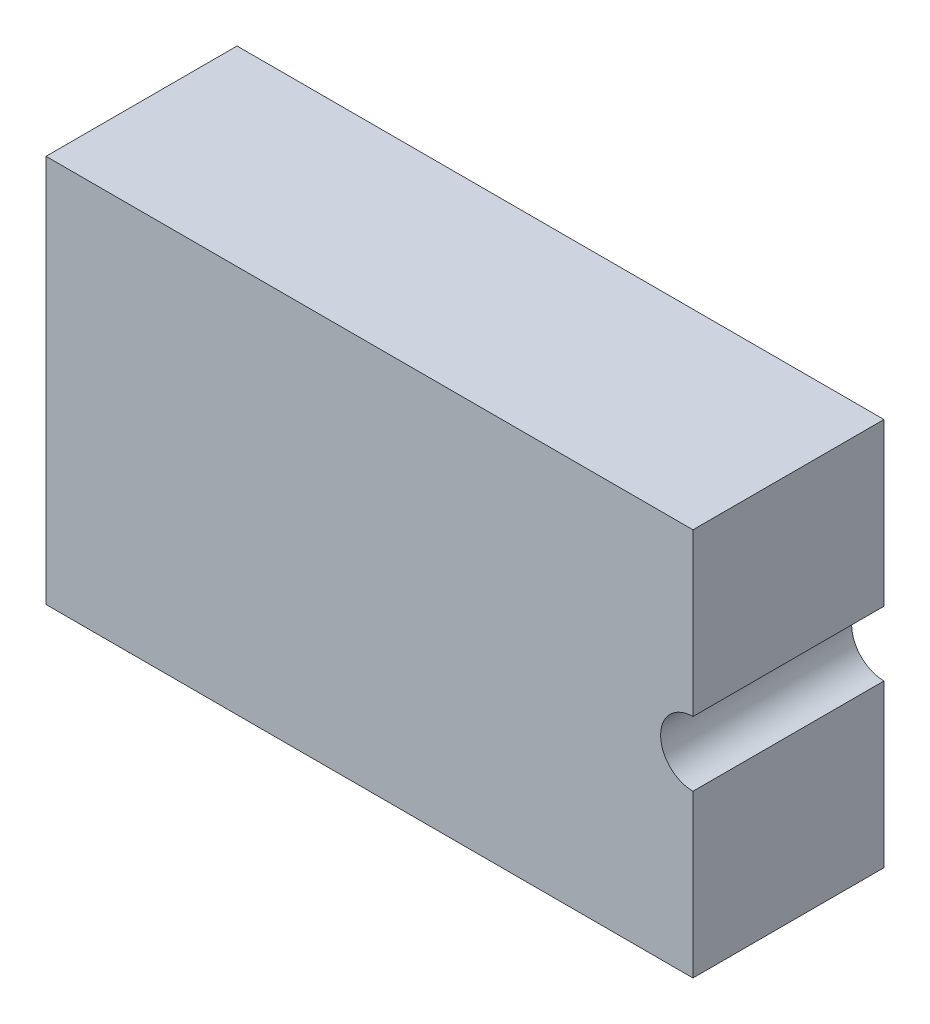
ISO-10303-21;
HEADER;
FILE_DESCRIPTION(('STEP AP214'),'2;1');
FILE_NAME('part.step','',(''),(''),'','','');
FILE_SCHEMA(('AUTOMOTIVE_DESIGN { 1 0 10303 214 1 1 1 1 }'));
ENDSEC;
DATA;
#1=APPLICATION_CONTEXT('core data for automotive mechanical design processes');
#2=APPLICATION_PROTOCOL_DEFINITION('international standard','automotive_design',2000,#1);
#3=PRODUCT_CONTEXT('',#1,'mechanical');
#4=PRODUCT('Part','Part','',(#3));
#5=PRODUCT_RELATED_PRODUCT_CATEGORY('part','',(#4));
#6=PRODUCT_DEFINITION_FORMATION('','',#4);
#7=PRODUCT_DEFINITION_CONTEXT('part definition',#1,'design');
#8=PRODUCT_DEFINITION('design','',#6,#7);
#9=PRODUCT_DEFINITION_SHAPE('','',#8);
#10=(LENGTH_UNIT() NAMED_UNIT(*) SI_UNIT(.MILLI.,.METRE.));
#11=(NAMED_UNIT(*) PLANE_ANGLE_UNIT() SI_UNIT($,.RADIAN.));
#12=(NAMED_UNIT(*) SI_UNIT($,.STERADIAN.) SOLID_ANGLE_UNIT());
#13=UNCERTAINTY_MEASURE_WITH_UNIT(LENGTH_MEASURE(1.E-05),#10,'distance_accuracy_value','');
#14=(GEOMETRIC_REPRESENTATION_CONTEXT(3) GLOBAL_UNCERTAINTY_ASSIGNED_CONTEXT((#13)) GLOBAL_UNIT_ASSIGNED_CONTEXT((#10,
#11,#12)) REPRESENTATION_CONTEXT('',''));
#15=CARTESIAN_POINT('',(0.,0.,0.));
#16=DIRECTION('',(0.,0.,1.));
#17=DIRECTION('',(1.,0.,0.));
#18=AXIS2_PLACEMENT_3D('',#15,#16,#17);
#19=CARTESIAN_POINT('',(12.409932,44.424092,1.822704));
#20=DIRECTION('',(1.,0.,0.));
#21=DIRECTION('',(0.,1.,0.));
#22=AXIS2_PLACEMENT_3D('',#19,#20,#21);
#23=PLANE('',#22);
#24=DIRECTION('',(0.,0.,1.));
#25=VECTOR('',#24,1.);
#26=CARTESIAN_POINT('',(12.409932,41.376092,0.32258));
#27=LINE('',#26,#25);
#28=CARTESIAN_POINT('',(12.409932,41.376092,0.32258));
#29=VERTEX_POINT('',#28);
#30=CARTESIAN_POINT('',(12.409932,41.376092,1.822704));
#31=VERTEX_POINT('',#30);
#32=EDGE_CURVE('E11',#29,#31,#27,.T.);
#33=ORIENTED_EDGE('',*,*,#32,.T.);
#34=DIRECTION('',(0.,1.,0.));
#35=VECTOR('',#34,1.);
#36=CARTESIAN_POINT('',(12.409932,41.376092,1.822704));
#37=LINE('',#36,#35);
#38=CARTESIAN_POINT('',(12.409932,44.424092,1.822704));
#39=VERTEX_POINT('',#38);
#40=EDGE_CURVE('E124',#31,#39,#37,.T.);
#41=ORIENTED_EDGE('',*,*,#40,.T.);
#42=DIRECTION('',(0.,0.,1.));
#43=VECTOR('',#42,1.);
#44=CARTESIAN_POINT('',(12.409932,44.424092,0.32258));
#45=LINE('',#44,#43);
#46=CARTESIAN_POINT('',(12.409932,44.424092,0.32258));
#47=VERTEX_POINT('',#46);
#48=EDGE_CURVE('E96',#47,#39,#45,.T.);
#49=ORIENTED_EDGE('',*,*,#48,.F.);
#50=DIRECTION('',(0.,-1.,0.));
#51=VECTOR('',#50,1.);
#52=CARTESIAN_POINT('',(12.409932,44.424092,0.32258));
#53=LINE('',#52,#51);
#54=EDGE_CURVE('E91',#47,#29,#53,.T.);
#55=ORIENTED_EDGE('',*,*,#54,.T.);
#56=EDGE_LOOP('',(#33,#41,#49,#55));
#57=FACE_BOUND('',#56,.T.);
#58=ADVANCED_FACE('F18',(#57),#23,.F.);
#59=CARTESIAN_POINT('',(12.409932,41.376092,1.822704));
#60=DIRECTION('',(0.,1.,0.));
#61=DIRECTION('',(1.,0.,0.));
#62=AXIS2_PLACEMENT_3D('',#59,#60,#61);
#63=PLANE('',#62);
#64=DIRECTION('',(0.,0.,1.));
#65=VECTOR('',#64,1.);
#66=CARTESIAN_POINT('',(17.489932,41.376092,0.32258));
#67=LINE('',#66,#65);
#68=CARTESIAN_POINT('',(17.489932,41.376092,0.32258));
#69=VERTEX_POINT('',#68);
#70=CARTESIAN_POINT('',(17.489932,41.376092,1.822704));
#71=VERTEX_POINT('',#70);
#72=EDGE_CURVE('E21',#69,#71,#67,.T.);
#73=ORIENTED_EDGE('',*,*,#72,.T.);
#74=DIRECTION('',(-1.,0.,0.));
#75=VECTOR('',#74,1.);
#76=CARTESIAN_POINT('',(17.489932,41.376092,1.822704));
#77=LINE('',#76,#75);
#78=EDGE_CURVE('E126',#71,#31,#77,.T.);
#79=ORIENTED_EDGE('',*,*,#78,.T.);
#80=ORIENTED_EDGE('',*,*,#32,.F.);
#81=DIRECTION('',(1.,0.,0.));
#82=VECTOR('',#81,1.);
#83=CARTESIAN_POINT('',(12.409932,41.376092,0.32258));
#84=LINE('',#83,#82);
#85=EDGE_CURVE('E129',#29,#69,#84,.T.);
#86=ORIENTED_EDGE('',*,*,#85,.T.);
#87=EDGE_LOOP('',(#73,#79,#80,#86));
#88=FACE_BOUND('',#87,.T.);
#89=ADVANCED_FACE('F198',(#88),#63,.F.);
#90=CARTESIAN_POINT('',(17.489932,41.376092,1.822704));
#91=DIRECTION('',(-1.,0.,0.));
#92=DIRECTION('',(0.,0.,1.));
#93=AXIS2_PLACEMENT_3D('',#90,#91,#92);
#94=PLANE('',#93);
#95=DIRECTION('',(0.,0.,-1.));
#96=VECTOR('',#95,1.);
#97=CARTESIAN_POINT('',(17.489932,42.646092,1.822704));
#98=LINE('',#97,#96);
#99=CARTESIAN_POINT('',(17.489932,42.646092,1.822704));
#100=VERTEX_POINT('',#99);
#101=CARTESIAN_POINT('',(17.489932,42.646092,0.32258));
#102=VERTEX_POINT('',#101);
#103=EDGE_CURVE('E39',#100,#102,#98,.T.);
#104=ORIENTED_EDGE('',*,*,#103,.F.);
#105=DIRECTION('',(0.,-1.,0.));
#106=VECTOR('',#105,1.);
#107=CARTESIAN_POINT('',(17.489932,42.646092,1.822704));
#108=LINE('',#107,#106);
#109=EDGE_CURVE('E135',#100,#71,#108,.T.);
#110=ORIENTED_EDGE('',*,*,#109,.T.);
#111=ORIENTED_EDGE('',*,*,#72,.F.);
#112=DIRECTION('',(0.,1.,0.));
#113=VECTOR('',#112,1.);
#114=CARTESIAN_POINT('',(17.489932,41.376092,0.32258));
#115=LINE('',#114,#113);
#116=EDGE_CURVE('E127',#69,#102,#115,.T.);
#117=ORIENTED_EDGE('',*,*,#116,.T.);
#118=EDGE_LOOP('',(#104,#110,#111,#117));
#119=FACE_BOUND('',#118,.T.);
#120=ADVANCED_FACE('F192',(#119),#94,.F.);
#121=CARTESIAN_POINT('',(17.489932,42.900092,1.822704));
#122=DIRECTION('',(0.,0.,-1.));
#123=DIRECTION('',(-1.,0.,0.));
#124=AXIS2_PLACEMENT_3D('',#121,#122,#123);
#125=CYLINDRICAL_SURFACE('',#124,0.254);
#126=CARTESIAN_POINT('',(17.489932,42.900092,0.32258));
#127=DIRECTION('',(0.,0.,1.));
#128=DIRECTION('',(0.,1.,0.));
#129=AXIS2_PLACEMENT_3D('',#126,#127,#128);
#130=CIRCLE('',#129,0.254);
#131=CARTESIAN_POINT('',(17.489932,43.154092,0.32258));
#132=VERTEX_POINT('',#131);
#133=EDGE_CURVE('E106',#132,#102,#130,.T.);
#134=ORIENTED_EDGE('',*,*,#133,.F.);
#135=DIRECTION('',(0.,0.,1.));
#136=VECTOR('',#135,1.);
#137=CARTESIAN_POINT('',(17.489932,43.154092,0.32258));
#138=LINE('',#137,#136);
#139=CARTESIAN_POINT('',(17.489932,43.154092,1.822704));
#140=VERTEX_POINT('',#139);
#141=EDGE_CURVE('E104',#132,#140,#138,.T.);
#142=ORIENTED_EDGE('',*,*,#141,.T.);
#143=CARTESIAN_POINT('',(17.489932,42.900092,1.822704));
#144=DIRECTION('',(0.,0.,-1.));
#145=DIRECTION('',(0.,-1.,0.));
#146=AXIS2_PLACEMENT_3D('',#143,#144,#145);
#147=CIRCLE('',#146,0.254);
#148=EDGE_CURVE('E122',#100,#140,#147,.T.);
#149=ORIENTED_EDGE('',*,*,#148,.F.);
#150=ORIENTED_EDGE('',*,*,#103,.T.);
#151=EDGE_LOOP('',(#134,#142,#149,#150));
#152=FACE_BOUND('',#151,.T.);
#153=ADVANCED_FACE('F197',(#152),#125,.F.);
#154=CARTESIAN_POINT('',(17.489932,42.900092,1.822704));
#155=DIRECTION('',(0.,0.,-1.));
#156=DIRECTION('',(0.,-1.,0.));
#157=AXIS2_PLACEMENT_3D('',#154,#155,#156);
#158=PLANE('',#157);
#159=DIRECTION('',(1.,0.,0.));
#160=VECTOR('',#159,1.);
#161=CARTESIAN_POINT('',(12.409932,44.424092,1.822704));
#162=LINE('',#161,#160);
#163=CARTESIAN_POINT('',(17.489932,44.424092,1.822704));
#164=VERTEX_POINT('',#163);
#165=EDGE_CURVE('E110',#39,#164,#162,.T.);
#166=ORIENTED_EDGE('',*,*,#165,.F.);
#167=ORIENTED_EDGE('',*,*,#40,.F.);
#168=ORIENTED_EDGE('',*,*,#78,.F.);
#169=ORIENTED_EDGE('',*,*,#109,.F.);
#170=ORIENTED_EDGE('',*,*,#148,.T.);
#171=DIRECTION('',(0.,-1.,0.));
#172=VECTOR('',#171,1.);
#173=CARTESIAN_POINT('',(17.489932,44.424092,1.822704));
#174=LINE('',#173,#172);
#175=EDGE_CURVE('E113',#164,#140,#174,.T.);
#176=ORIENTED_EDGE('',*,*,#175,.F.);
#177=EDGE_LOOP('',(#166,#167,#168,#169,#170,#176));
#178=FACE_BOUND('',#177,.T.);
#179=ADVANCED_FACE('F184',(#178),#158,.F.);
#180=CARTESIAN_POINT('',(17.489932,44.424092,1.822704));
#181=DIRECTION('',(0.,-1.,0.));
#182=DIRECTION('',(0.,0.,-1.));
#183=AXIS2_PLACEMENT_3D('',#180,#181,#182);
#184=PLANE('',#183);
#185=ORIENTED_EDGE('',*,*,#48,.T.);
#186=ORIENTED_EDGE('',*,*,#165,.T.);
#187=DIRECTION('',(0.,0.,1.));
#188=VECTOR('',#187,1.);
#189=CARTESIAN_POINT('',(17.489932,44.424092,0.32258));
#190=LINE('',#189,#188);
#191=CARTESIAN_POINT('',(17.489932,44.424092,0.32258));
#192=VERTEX_POINT('',#191);
#193=EDGE_CURVE('E102',#192,#164,#190,.T.);
#194=ORIENTED_EDGE('',*,*,#193,.F.);
#195=DIRECTION('',(-1.,0.,0.));
#196=VECTOR('',#195,1.);
#197=CARTESIAN_POINT('',(17.489932,44.424092,0.32258));
#198=LINE('',#197,#196);
#199=EDGE_CURVE('E84',#192,#47,#198,.T.);
#200=ORIENTED_EDGE('',*,*,#199,.T.);
#201=EDGE_LOOP('',(#185,#186,#194,#200));
#202=FACE_BOUND('',#201,.T.);
#203=ADVANCED_FACE('F108',(#202),#184,.F.);
#204=CARTESIAN_POINT('',(17.489932,42.900092,0.32258));
#205=DIRECTION('',(0.,0.,-1.));
#206=DIRECTION('',(0.,-1.,0.));
#207=AXIS2_PLACEMENT_3D('',#204,#205,#206);
#208=PLANE('',#207);
#209=ORIENTED_EDGE('',*,*,#133,.T.);
#210=ORIENTED_EDGE('',*,*,#116,.F.);
#211=ORIENTED_EDGE('',*,*,#85,.F.);
#212=ORIENTED_EDGE('',*,*,#54,.F.);
#213=ORIENTED_EDGE('',*,*,#199,.F.);
#214=DIRECTION('',(0.,1.,0.));
#215=VECTOR('',#214,1.);
#216=CARTESIAN_POINT('',(17.489932,43.154092,0.32258));
#217=LINE('',#216,#215);
#218=EDGE_CURVE('E87',#132,#192,#217,.T.);
#219=ORIENTED_EDGE('',*,*,#218,.F.);
#220=EDGE_LOOP('',(#209,#210,#211,#212,#213,#219));
#221=FACE_BOUND('',#220,.T.);
#222=ADVANCED_FACE('F86',(#221),#208,.T.);
#223=CARTESIAN_POINT('',(17.489932,43.154092,1.822704));
#224=DIRECTION('',(-1.,0.,0.));
#225=DIRECTION('',(0.,0.,1.));
#226=AXIS2_PLACEMENT_3D('',#223,#224,#225);
#227=PLANE('',#226);
#228=ORIENTED_EDGE('',*,*,#193,.T.);
#229=ORIENTED_EDGE('',*,*,#175,.T.);
#230=ORIENTED_EDGE('',*,*,#141,.F.);
#231=ORIENTED_EDGE('',*,*,#218,.T.);
#232=EDGE_LOOP('',(#228,#229,#230,#231));
#233=FACE_BOUND('',#232,.T.);
#234=ADVANCED_FACE('F100',(#233),#227,.F.);
#235=CLOSED_SHELL('',(#58,#89,#120,#153,#179,#203,#222,#234));
#236=MANIFOLD_SOLID_BREP('B1',#235);
#237=ADVANCED_BREP_SHAPE_REPRESENTATION('',(#18,#236),#14);
#238=SHAPE_DEFINITION_REPRESENTATION(#9,#237);
ENDSEC;
END-ISO-10303-21;
